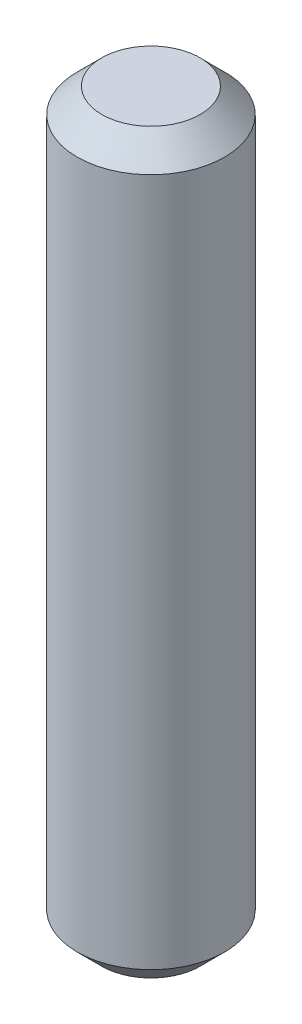
ISO-10303-21;
HEADER;
FILE_DESCRIPTION(('STEP AP214'),'2;1');
FILE_NAME('part.step','',(''),(''),'','','');
FILE_SCHEMA(('AUTOMOTIVE_DESIGN { 1 0 10303 214 1 1 1 1 }'));
ENDSEC;
DATA;
#1=APPLICATION_CONTEXT('core data for automotive mechanical design processes');
#2=APPLICATION_PROTOCOL_DEFINITION('international standard','automotive_design',2000,#1);
#3=PRODUCT_CONTEXT('',#1,'mechanical');
#4=PRODUCT('Part','Part','',(#3));
#5=PRODUCT_RELATED_PRODUCT_CATEGORY('part','',(#4));
#6=PRODUCT_DEFINITION_FORMATION('','',#4);
#7=PRODUCT_DEFINITION_CONTEXT('part definition',#1,'design');
#8=PRODUCT_DEFINITION('design','',#6,#7);
#9=PRODUCT_DEFINITION_SHAPE('','',#8);
#10=(LENGTH_UNIT() NAMED_UNIT(*) SI_UNIT(.MILLI.,.METRE.));
#11=(NAMED_UNIT(*) PLANE_ANGLE_UNIT() SI_UNIT($,.RADIAN.));
#12=(NAMED_UNIT(*) SI_UNIT($,.STERADIAN.) SOLID_ANGLE_UNIT());
#13=UNCERTAINTY_MEASURE_WITH_UNIT(LENGTH_MEASURE(1.E-05),#10,'distance_accuracy_value','');
#14=(GEOMETRIC_REPRESENTATION_CONTEXT(3) GLOBAL_UNCERTAINTY_ASSIGNED_CONTEXT((#13)) GLOBAL_UNIT_ASSIGNED_CONTEXT((#10,
#11,#12)) REPRESENTATION_CONTEXT('',''));
#15=CARTESIAN_POINT('',(0.,0.,0.));
#16=DIRECTION('',(0.,0.,1.));
#17=DIRECTION('',(1.,0.,0.));
#18=AXIS2_PLACEMENT_3D('',#15,#16,#17);
#19=CARTESIAN_POINT('',(0.,15.,0.));
#20=DIRECTION('',(0.,-1.,0.));
#21=DIRECTION('',(0.,0.,-1.));
#22=AXIS2_PLACEMENT_3D('',#19,#20,#21);
#23=CYLINDRICAL_SURFACE('',#22,1.5);
#24=CARTESIAN_POINT('',(0.,0.499999999999999,0.));
#25=DIRECTION('',(0.,1.,0.));
#26=DIRECTION('',(0.,0.,1.));
#27=AXIS2_PLACEMENT_3D('',#24,#25,#26);
#28=CIRCLE('',#27,1.5);
#29=CARTESIAN_POINT('',(0.,0.499999999999999,1.5));
#30=VERTEX_POINT('',#29);
#31=EDGE_CURVE('E45',#30,#30,#28,.T.);
#32=ORIENTED_EDGE('',*,*,#31,.T.);
#33=EDGE_LOOP('',(#32));
#34=FACE_BOUND('',#33,.T.);
#35=CARTESIAN_POINT('',(0.,14.5,0.));
#36=DIRECTION('',(0.,1.,0.));
#37=DIRECTION('',(0.,0.,1.));
#38=AXIS2_PLACEMENT_3D('',#35,#36,#37);
#39=CIRCLE('',#38,1.5);
#40=CARTESIAN_POINT('',(0.,14.5,1.5));
#41=VERTEX_POINT('',#40);
#42=EDGE_CURVE('E49',#41,#41,#39,.F.);
#43=ORIENTED_EDGE('',*,*,#42,.T.);
#44=EDGE_LOOP('',(#43));
#45=FACE_BOUND('',#44,.T.);
#46=ADVANCED_FACE('F33',(#34,#45),#23,.T.);
#47=CARTESIAN_POINT('',(0.,15.,0.));
#48=DIRECTION('',(0.,1.,0.));
#49=DIRECTION('',(0.,0.,1.));
#50=AXIS2_PLACEMENT_3D('',#47,#48,#49);
#51=PLANE('',#50);
#52=CARTESIAN_POINT('',(0.,15.,0.));
#53=DIRECTION('',(0.,1.,0.));
#54=DIRECTION('',(0.,0.,1.));
#55=AXIS2_PLACEMENT_3D('',#52,#53,#54);
#56=CIRCLE('',#55,0.999999999999999);
#57=CARTESIAN_POINT('',(0.,15.,0.999999999999999));
#58=VERTEX_POINT('',#57);
#59=EDGE_CURVE('E10',#58,#58,#56,.T.);
#60=ORIENTED_EDGE('',*,*,#59,.T.);
#61=EDGE_LOOP('',(#60));
#62=FACE_BOUND('',#61,.T.);
#63=ADVANCED_FACE('F65',(#62),#51,.T.);
#64=CARTESIAN_POINT('',(0.,0.,0.));
#65=DIRECTION('',(0.,1.,0.));
#66=DIRECTION('',(0.,0.,1.));
#67=AXIS2_PLACEMENT_3D('',#64,#65,#66);
#68=PLANE('',#67);
#69=CARTESIAN_POINT('',(0.,0.,0.));
#70=DIRECTION('',(0.,1.,0.));
#71=DIRECTION('',(0.,0.,1.));
#72=AXIS2_PLACEMENT_3D('',#69,#70,#71);
#73=CIRCLE('',#72,0.999999999999999);
#74=CARTESIAN_POINT('',(0.,0.,0.999999999999999));
#75=VERTEX_POINT('',#74);
#76=EDGE_CURVE('E41',#75,#75,#73,.F.);
#77=ORIENTED_EDGE('',*,*,#76,.T.);
#78=EDGE_LOOP('',(#77));
#79=FACE_BOUND('',#78,.T.);
#80=ADVANCED_FACE('F62',(#79),#68,.F.);
#81=CARTESIAN_POINT('',(0.,0.499999999999999,0.));
#82=DIRECTION('',(0.,1.,0.));
#83=DIRECTION('',(0.,0.,1.));
#84=AXIS2_PLACEMENT_3D('',#81,#82,#83);
#85=CONICAL_SURFACE('',#84,1.5,0.78539816339745);
#86=ORIENTED_EDGE('',*,*,#76,.F.);
#87=EDGE_LOOP('',(#86));
#88=FACE_BOUND('',#87,.T.);
#89=ORIENTED_EDGE('',*,*,#31,.F.);
#90=EDGE_LOOP('',(#89));
#91=FACE_BOUND('',#90,.T.);
#92=ADVANCED_FACE('F58',(#88,#91),#85,.T.);
#93=CARTESIAN_POINT('',(0.,15.,0.));
#94=DIRECTION('',(0.,-1.,0.));
#95=DIRECTION('',(0.,0.,-1.));
#96=AXIS2_PLACEMENT_3D('',#93,#94,#95);
#97=CONICAL_SURFACE('',#96,0.999999999999999,0.785398163397446);
#98=ORIENTED_EDGE('',*,*,#42,.F.);
#99=EDGE_LOOP('',(#98));
#100=FACE_BOUND('',#99,.T.);
#101=ORIENTED_EDGE('',*,*,#59,.F.);
#102=EDGE_LOOP('',(#101));
#103=FACE_BOUND('',#102,.T.);
#104=ADVANCED_FACE('F36',(#100,#103),#97,.T.);
#105=CLOSED_SHELL('',(#46,#63,#80,#92,#104));
#106=MANIFOLD_SOLID_BREP('B2',#105);
#107=ADVANCED_BREP_SHAPE_REPRESENTATION('',(#18,#106),#14);
#108=SHAPE_DEFINITION_REPRESENTATION(#9,#107);
ENDSEC;
END-ISO-10303-21;
